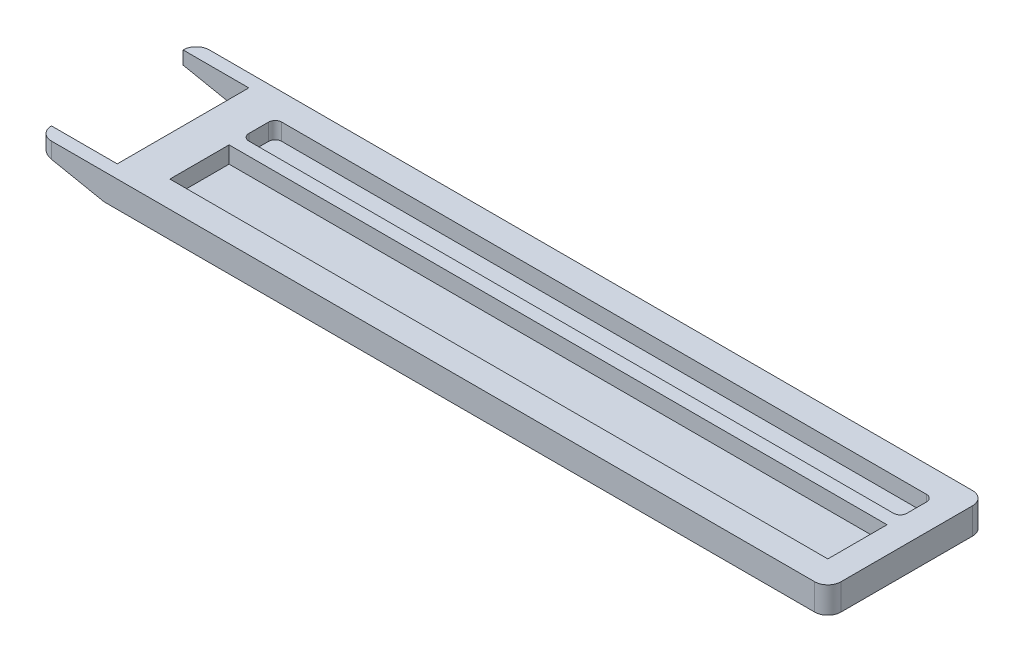
ISO-10303-21;
HEADER;
FILE_DESCRIPTION(('STEP AP214'),'2;1');
FILE_NAME('part.step','',(''),(''),'','','');
FILE_SCHEMA(('AUTOMOTIVE_DESIGN { 1 0 10303 214 1 1 1 1 }'));
ENDSEC;
DATA;
#1=APPLICATION_CONTEXT('core data for automotive mechanical design processes');
#2=APPLICATION_PROTOCOL_DEFINITION('international standard','automotive_design',2000,#1);
#3=PRODUCT_CONTEXT('',#1,'mechanical');
#4=PRODUCT('Part','Part','',(#3));
#5=PRODUCT_RELATED_PRODUCT_CATEGORY('part','',(#4));
#6=PRODUCT_DEFINITION_FORMATION('','',#4);
#7=PRODUCT_DEFINITION_CONTEXT('part definition',#1,'design');
#8=PRODUCT_DEFINITION('design','',#6,#7);
#9=PRODUCT_DEFINITION_SHAPE('','',#8);
#10=(LENGTH_UNIT() NAMED_UNIT(*) SI_UNIT(.MILLI.,.METRE.));
#11=(NAMED_UNIT(*) PLANE_ANGLE_UNIT() SI_UNIT($,.RADIAN.));
#12=(NAMED_UNIT(*) SI_UNIT($,.STERADIAN.) SOLID_ANGLE_UNIT());
#13=UNCERTAINTY_MEASURE_WITH_UNIT(LENGTH_MEASURE(1.E-05),#10,'distance_accuracy_value','');
#14=(GEOMETRIC_REPRESENTATION_CONTEXT(3) GLOBAL_UNCERTAINTY_ASSIGNED_CONTEXT((#13)) GLOBAL_UNIT_ASSIGNED_CONTEXT((#10,
#11,#12)) REPRESENTATION_CONTEXT('',''));
#15=CARTESIAN_POINT('',(0.,0.,0.));
#16=DIRECTION('',(0.,0.,1.));
#17=DIRECTION('',(1.,0.,0.));
#18=AXIS2_PLACEMENT_3D('',#15,#16,#17);
#19=CARTESIAN_POINT('',(-300.,10.,-60.001));
#20=DIRECTION('',(0.196116135138184,0.98058067569092,0.));
#21=DIRECTION('',(-0.98058067569092,0.196116135138184,0.));
#22=AXIS2_PLACEMENT_3D('',#19,#20,#21);
#23=PLANE('',#22);
#24=DIRECTION('',(0.,0.,1.));
#25=VECTOR('',#24,1.);
#26=CARTESIAN_POINT('',(-250.,0.,-60.001));
#27=LINE('',#26,#25);
#28=CARTESIAN_POINT('',(-250.,0.,-60.));
#29=VERTEX_POINT('',#28);
#30=CARTESIAN_POINT('',(-250.,0.,-50.));
#31=VERTEX_POINT('',#30);
#32=EDGE_CURVE('E347',#29,#31,#27,.T.);
#33=ORIENTED_EDGE('',*,*,#32,.T.);
#34=DIRECTION('',(0.98058067569092,-0.196116135138184,0.));
#35=VECTOR('',#34,1.);
#36=CARTESIAN_POINT('',(-298.076730769231,9.61534615384615,-49.9999999999999));
#37=LINE('',#36,#35);
#38=CARTESIAN_POINT('',(-300.,10.,-49.9999999999999));
#39=VERTEX_POINT('',#38);
#40=EDGE_CURVE('E211',#39,#31,#37,.T.);
#41=ORIENTED_EDGE('',*,*,#40,.F.);
#42=CARTESIAN_POINT('',(-290.,8.,-50.));
#43=DIRECTION('',(0.196116135138184,0.98058067569092,0.));
#44=DIRECTION('',(0.98058067569092,-0.196116135138184,0.));
#45=AXIS2_PLACEMENT_3D('',#42,#43,#44);
#46=ELLIPSE('',#45,10.1980390271856,10.);
#47=CARTESIAN_POINT('',(-290.,8.,-60.));
#48=VERTEX_POINT('',#47);
#49=EDGE_CURVE('E368',#39,#48,#46,.F.);
#50=ORIENTED_EDGE('',*,*,#49,.T.);
#51=DIRECTION('',(0.98058067569092,-0.196116135138184,0.));
#52=VECTOR('',#51,1.);
#53=CARTESIAN_POINT('',(-300.,10.,-60.));
#54=LINE('',#53,#52);
#55=EDGE_CURVE('E297',#48,#29,#54,.T.);
#56=ORIENTED_EDGE('',*,*,#55,.T.);
#57=EDGE_LOOP('',(#33,#41,#50,#56));
#58=FACE_BOUND('',#57,.T.);
#59=ADVANCED_FACE('F36',(#58),#23,.F.);
#60=CARTESIAN_POINT('',(300.,20.,60.));
#61=DIRECTION('',(0.,0.,-1.));
#62=DIRECTION('',(-1.,0.,0.));
#63=AXIS2_PLACEMENT_3D('',#60,#61,#62);
#64=PLANE('',#63);
#65=DIRECTION('',(1.,0.,0.));
#66=VECTOR('',#65,1.);
#67=CARTESIAN_POINT('',(300.,20.,60.));
#68=LINE('',#67,#66);
#69=CARTESIAN_POINT('',(-290.,20.,60.));
#70=VERTEX_POINT('',#69);
#71=CARTESIAN_POINT('',(290.,20.,60.));
#72=VERTEX_POINT('',#71);
#73=EDGE_CURVE('E351',#70,#72,#68,.T.);
#74=ORIENTED_EDGE('',*,*,#73,.F.);
#75=DIRECTION('',(0.,-1.,0.));
#76=VECTOR('',#75,1.);
#77=CARTESIAN_POINT('',(-290.,20.,60.));
#78=LINE('',#77,#76);
#79=CARTESIAN_POINT('',(-290.,8.,60.));
#80=VERTEX_POINT('',#79);
#81=EDGE_CURVE('E216',#70,#80,#78,.T.);
#82=ORIENTED_EDGE('',*,*,#81,.T.);
#83=DIRECTION('',(-0.98058067569092,0.196116135138184,0.));
#84=VECTOR('',#83,1.);
#85=CARTESIAN_POINT('',(-300.,10.,60.));
#86=LINE('',#85,#84);
#87=CARTESIAN_POINT('',(-250.,0.,60.));
#88=VERTEX_POINT('',#87);
#89=EDGE_CURVE('E300',#88,#80,#86,.T.);
#90=ORIENTED_EDGE('',*,*,#89,.F.);
#91=DIRECTION('',(1.,0.,0.));
#92=VECTOR('',#91,1.);
#93=CARTESIAN_POINT('',(300.,0.,60.));
#94=LINE('',#93,#92);
#95=CARTESIAN_POINT('',(290.,0.,60.));
#96=VERTEX_POINT('',#95);
#97=EDGE_CURVE('E350',#88,#96,#94,.T.);
#98=ORIENTED_EDGE('',*,*,#97,.T.);
#99=DIRECTION('',(0.,-1.,0.));
#100=VECTOR('',#99,1.);
#101=CARTESIAN_POINT('',(290.,20.,60.));
#102=LINE('',#101,#100);
#103=EDGE_CURVE('E221',#96,#72,#102,.F.);
#104=ORIENTED_EDGE('',*,*,#103,.T.);
#105=EDGE_LOOP('',(#74,#82,#90,#98,#104));
#106=FACE_BOUND('',#105,.T.);
#107=ADVANCED_FACE('F392',(#106),#64,.F.);
#108=CARTESIAN_POINT('',(300.,20.,60.));
#109=DIRECTION('',(-1.,0.,0.));
#110=DIRECTION('',(0.,0.,1.));
#111=AXIS2_PLACEMENT_3D('',#108,#109,#110);
#112=PLANE('',#111);
#113=DIRECTION('',(0.,0.,-1.));
#114=VECTOR('',#113,1.);
#115=CARTESIAN_POINT('',(300.,0.,60.));
#116=LINE('',#115,#114);
#117=CARTESIAN_POINT('',(300.,0.,50.));
#118=VERTEX_POINT('',#117);
#119=CARTESIAN_POINT('',(300.,0.,-50.));
#120=VERTEX_POINT('',#119);
#121=EDGE_CURVE('E361',#118,#120,#116,.T.);
#122=ORIENTED_EDGE('',*,*,#121,.T.);
#123=DIRECTION('',(0.,-1.,0.));
#124=VECTOR('',#123,1.);
#125=CARTESIAN_POINT('',(300.,20.,-50.));
#126=LINE('',#125,#124);
#127=CARTESIAN_POINT('',(300.,20.,-50.));
#128=VERTEX_POINT('',#127);
#129=EDGE_CURVE('E236',#120,#128,#126,.F.);
#130=ORIENTED_EDGE('',*,*,#129,.T.);
#131=DIRECTION('',(0.,0.,-1.));
#132=VECTOR('',#131,1.);
#133=CARTESIAN_POINT('',(300.,20.,60.));
#134=LINE('',#133,#132);
#135=CARTESIAN_POINT('',(300.,20.,50.));
#136=VERTEX_POINT('',#135);
#137=EDGE_CURVE('E353',#136,#128,#134,.T.);
#138=ORIENTED_EDGE('',*,*,#137,.F.);
#139=DIRECTION('',(0.,-1.,0.));
#140=VECTOR('',#139,1.);
#141=CARTESIAN_POINT('',(300.,20.,50.));
#142=LINE('',#141,#140);
#143=EDGE_CURVE('E233',#136,#118,#142,.T.);
#144=ORIENTED_EDGE('',*,*,#143,.T.);
#145=EDGE_LOOP('',(#122,#130,#138,#144));
#146=FACE_BOUND('',#145,.T.);
#147=ADVANCED_FACE('F381',(#146),#112,.F.);
#148=CARTESIAN_POINT('',(300.,20.,-60.));
#149=DIRECTION('',(0.,0.,1.));
#150=DIRECTION('',(1.,0.,0.));
#151=AXIS2_PLACEMENT_3D('',#148,#149,#150);
#152=PLANE('',#151);
#153=ORIENTED_EDGE('',*,*,#55,.F.);
#154=DIRECTION('',(0.,-1.,0.));
#155=VECTOR('',#154,1.);
#156=CARTESIAN_POINT('',(-290.,20.,-60.));
#157=LINE('',#156,#155);
#158=CARTESIAN_POINT('',(-290.,20.,-60.));
#159=VERTEX_POINT('',#158);
#160=EDGE_CURVE('E373',#48,#159,#157,.F.);
#161=ORIENTED_EDGE('',*,*,#160,.T.);
#162=DIRECTION('',(-1.,0.,0.));
#163=VECTOR('',#162,1.);
#164=CARTESIAN_POINT('',(300.,20.,-60.));
#165=LINE('',#164,#163);
#166=CARTESIAN_POINT('',(290.,20.,-60.));
#167=VERTEX_POINT('',#166);
#168=EDGE_CURVE('E201',#167,#159,#165,.T.);
#169=ORIENTED_EDGE('',*,*,#168,.F.);
#170=DIRECTION('',(0.,-1.,0.));
#171=VECTOR('',#170,1.);
#172=CARTESIAN_POINT('',(290.,20.,-60.));
#173=LINE('',#172,#171);
#174=CARTESIAN_POINT('',(290.,0.,-60.));
#175=VERTEX_POINT('',#174);
#176=EDGE_CURVE('E370',#167,#175,#173,.T.);
#177=ORIENTED_EDGE('',*,*,#176,.T.);
#178=DIRECTION('',(-1.,0.,0.));
#179=VECTOR('',#178,1.);
#180=CARTESIAN_POINT('',(300.,0.,-60.));
#181=LINE('',#180,#179);
#182=EDGE_CURVE('E354',#175,#29,#181,.T.);
#183=ORIENTED_EDGE('',*,*,#182,.T.);
#184=EDGE_LOOP('',(#153,#161,#169,#177,#183));
#185=FACE_BOUND('',#184,.T.);
#186=ADVANCED_FACE('F408',(#185),#152,.F.);
#187=CARTESIAN_POINT('',(0.,20.,0.));
#188=DIRECTION('',(0.,1.,0.));
#189=DIRECTION('',(0.,0.,1.));
#190=AXIS2_PLACEMENT_3D('',#187,#188,#189);
#191=PLANE('',#190);
#192=DIRECTION('',(-1.,0.,0.));
#193=VECTOR('',#192,1.);
#194=CARTESIAN_POINT('',(-300.,20.,-49.9999999999999));
#195=LINE('',#194,#193);
#196=CARTESIAN_POINT('',(-250.,20.,-50.));
#197=VERTEX_POINT('',#196);
#198=CARTESIAN_POINT('',(-300.,20.,-49.9999999999999));
#199=VERTEX_POINT('',#198);
#200=EDGE_CURVE('E414',#197,#199,#195,.T.);
#201=ORIENTED_EDGE('',*,*,#200,.F.);
#202=DIRECTION('',(0.,0.,-1.));
#203=VECTOR('',#202,1.);
#204=CARTESIAN_POINT('',(-250.,20.,-50.));
#205=LINE('',#204,#203);
#206=CARTESIAN_POINT('',(-250.,20.,50.0000000000001));
#207=VERTEX_POINT('',#206);
#208=EDGE_CURVE('E210',#207,#197,#205,.T.);
#209=ORIENTED_EDGE('',*,*,#208,.F.);
#210=DIRECTION('',(1.,0.,0.));
#211=VECTOR('',#210,1.);
#212=CARTESIAN_POINT('',(-300.,20.,50.));
#213=LINE('',#212,#211);
#214=CARTESIAN_POINT('',(-300.,20.,50.));
#215=VERTEX_POINT('',#214);
#216=EDGE_CURVE('E193',#215,#207,#213,.T.);
#217=ORIENTED_EDGE('',*,*,#216,.F.);
#218=CARTESIAN_POINT('',(-290.,20.,50.));
#219=DIRECTION('',(0.,1.,0.));
#220=DIRECTION('',(0.,0.,1.));
#221=AXIS2_PLACEMENT_3D('',#218,#219,#220);
#222=CIRCLE('',#221,10.);
#223=EDGE_CURVE('E207',#215,#70,#222,.T.);
#224=ORIENTED_EDGE('',*,*,#223,.T.);
#225=ORIENTED_EDGE('',*,*,#73,.T.);
#226=CARTESIAN_POINT('',(290.,20.,50.));
#227=DIRECTION('',(0.,1.,0.));
#228=DIRECTION('',(0.,0.,1.));
#229=AXIS2_PLACEMENT_3D('',#226,#227,#228);
#230=CIRCLE('',#229,10.);
#231=EDGE_CURVE('E223',#72,#136,#230,.T.);
#232=ORIENTED_EDGE('',*,*,#231,.T.);
#233=ORIENTED_EDGE('',*,*,#137,.T.);
#234=CARTESIAN_POINT('',(290.,20.,-50.));
#235=DIRECTION('',(0.,1.,0.));
#236=DIRECTION('',(0.,0.,1.));
#237=AXIS2_PLACEMENT_3D('',#234,#235,#236);
#238=CIRCLE('',#237,10.);
#239=EDGE_CURVE('E218',#128,#167,#238,.T.);
#240=ORIENTED_EDGE('',*,*,#239,.T.);
#241=ORIENTED_EDGE('',*,*,#168,.T.);
#242=CARTESIAN_POINT('',(-290.,20.,-50.));
#243=DIRECTION('',(0.,1.,0.));
#244=DIRECTION('',(0.,0.,1.));
#245=AXIS2_PLACEMENT_3D('',#242,#243,#244);
#246=CIRCLE('',#245,10.);
#247=EDGE_CURVE('E217',#159,#199,#246,.T.);
#248=ORIENTED_EDGE('',*,*,#247,.T.);
#249=EDGE_LOOP('',(#201,#209,#217,#224,#225,#232,#233,#240,#241,#248));
#250=FACE_BOUND('',#249,.T.);
#251=DIRECTION('',(0.,0.,1.));
#252=VECTOR('',#251,1.);
#253=CARTESIAN_POINT('',(-220.,20.,-40.));
#254=LINE('',#253,#252);
#255=CARTESIAN_POINT('',(-220.,20.,-35.));
#256=VERTEX_POINT('',#255);
#257=CARTESIAN_POINT('',(-220.,20.,-20.));
#258=VERTEX_POINT('',#257);
#259=EDGE_CURVE('E306',#256,#258,#254,.T.);
#260=ORIENTED_EDGE('',*,*,#259,.F.);
#261=CARTESIAN_POINT('',(-215.,20.,-35.));
#262=DIRECTION('',(0.,1.,0.));
#263=DIRECTION('',(0.,0.,1.));
#264=AXIS2_PLACEMENT_3D('',#261,#262,#263);
#265=CIRCLE('',#264,5.);
#266=CARTESIAN_POINT('',(-215.,20.,-40.));
#267=VERTEX_POINT('',#266);
#268=EDGE_CURVE('E11',#256,#267,#265,.F.);
#269=ORIENTED_EDGE('',*,*,#268,.T.);
#270=DIRECTION('',(-1.,0.,0.));
#271=VECTOR('',#270,1.);
#272=CARTESIAN_POINT('',(-220.,20.,-40.));
#273=LINE('',#272,#271);
#274=CARTESIAN_POINT('',(275.,20.,-40.));
#275=VERTEX_POINT('',#274);
#276=EDGE_CURVE('E274',#275,#267,#273,.T.);
#277=ORIENTED_EDGE('',*,*,#276,.F.);
#278=CARTESIAN_POINT('',(275.,20.,-35.));
#279=DIRECTION('',(0.,1.,0.));
#280=DIRECTION('',(0.,0.,1.));
#281=AXIS2_PLACEMENT_3D('',#278,#279,#280);
#282=CIRCLE('',#281,5.);
#283=CARTESIAN_POINT('',(280.,20.,-35.));
#284=VERTEX_POINT('',#283);
#285=EDGE_CURVE('E267',#275,#284,#282,.F.);
#286=ORIENTED_EDGE('',*,*,#285,.T.);
#287=DIRECTION('',(0.,0.,-1.));
#288=VECTOR('',#287,1.);
#289=CARTESIAN_POINT('',(280.,20.,-40.));
#290=LINE('',#289,#288);
#291=CARTESIAN_POINT('',(280.,20.,-20.));
#292=VERTEX_POINT('',#291);
#293=EDGE_CURVE('E272',#292,#284,#290,.T.);
#294=ORIENTED_EDGE('',*,*,#293,.F.);
#295=CARTESIAN_POINT('',(275.,20.,-20.));
#296=DIRECTION('',(0.,1.,0.));
#297=DIRECTION('',(0.,0.,1.));
#298=AXIS2_PLACEMENT_3D('',#295,#296,#297);
#299=CIRCLE('',#298,5.);
#300=CARTESIAN_POINT('',(275.,20.,-15.));
#301=VERTEX_POINT('',#300);
#302=EDGE_CURVE('E265',#292,#301,#299,.F.);
#303=ORIENTED_EDGE('',*,*,#302,.T.);
#304=DIRECTION('',(1.,0.,0.));
#305=VECTOR('',#304,1.);
#306=CARTESIAN_POINT('',(-220.,20.,-15.));
#307=LINE('',#306,#305);
#308=CARTESIAN_POINT('',(-215.,20.,-15.));
#309=VERTEX_POINT('',#308);
#310=EDGE_CURVE('E283',#309,#301,#307,.T.);
#311=ORIENTED_EDGE('',*,*,#310,.F.);
#312=CARTESIAN_POINT('',(-215.,20.,-20.));
#313=DIRECTION('',(0.,1.,0.));
#314=DIRECTION('',(0.,0.,1.));
#315=AXIS2_PLACEMENT_3D('',#312,#313,#314);
#316=CIRCLE('',#315,5.);
#317=EDGE_CURVE('E44',#309,#258,#316,.F.);
#318=ORIENTED_EDGE('',*,*,#317,.T.);
#319=EDGE_LOOP('',(#260,#269,#277,#286,#294,#303,#311,#318));
#320=FACE_BOUND('',#319,.T.);
#321=DIRECTION('',(0.,0.,1.));
#322=VECTOR('',#321,1.);
#323=CARTESIAN_POINT('',(-220.,20.,-4.99999999999995));
#324=LINE('',#323,#322);
#325=CARTESIAN_POINT('',(-220.,20.,-4.99999999999995));
#326=VERTEX_POINT('',#325);
#327=CARTESIAN_POINT('',(-220.,20.,40.));
#328=VERTEX_POINT('',#327);
#329=EDGE_CURVE('E327',#326,#328,#324,.T.);
#330=ORIENTED_EDGE('',*,*,#329,.F.);
#331=DIRECTION('',(-1.,0.,0.));
#332=VECTOR('',#331,1.);
#333=CARTESIAN_POINT('',(-220.,20.,-4.99999999999995));
#334=LINE('',#333,#332);
#335=CARTESIAN_POINT('',(280.,20.,-4.99999999999995));
#336=VERTEX_POINT('',#335);
#337=EDGE_CURVE('E317',#336,#326,#334,.T.);
#338=ORIENTED_EDGE('',*,*,#337,.F.);
#339=DIRECTION('',(0.,0.,-1.));
#340=VECTOR('',#339,1.);
#341=CARTESIAN_POINT('',(280.,20.,-4.99999999999995));
#342=LINE('',#341,#340);
#343=CARTESIAN_POINT('',(280.,20.,40.));
#344=VERTEX_POINT('',#343);
#345=EDGE_CURVE('E332',#344,#336,#342,.T.);
#346=ORIENTED_EDGE('',*,*,#345,.F.);
#347=DIRECTION('',(1.,0.,0.));
#348=VECTOR('',#347,1.);
#349=CARTESIAN_POINT('',(-220.,20.,40.));
#350=LINE('',#349,#348);
#351=EDGE_CURVE('E329',#328,#344,#350,.T.);
#352=ORIENTED_EDGE('',*,*,#351,.F.);
#353=EDGE_LOOP('',(#330,#338,#346,#352));
#354=FACE_BOUND('',#353,.T.);
#355=ADVANCED_FACE('F205',(#250,#320,#354),#191,.T.);
#356=CARTESIAN_POINT('',(0.,0.,0.));
#357=DIRECTION('',(0.,1.,0.));
#358=DIRECTION('',(0.,0.,1.));
#359=AXIS2_PLACEMENT_3D('',#356,#357,#358);
#360=PLANE('',#359);
#361=ORIENTED_EDGE('',*,*,#182,.F.);
#362=CARTESIAN_POINT('',(290.,0.,-50.));
#363=DIRECTION('',(0.,1.,0.));
#364=DIRECTION('',(0.,0.,1.));
#365=AXIS2_PLACEMENT_3D('',#362,#363,#364);
#366=CIRCLE('',#365,10.);
#367=EDGE_CURVE('E231',#175,#120,#366,.F.);
#368=ORIENTED_EDGE('',*,*,#367,.T.);
#369=ORIENTED_EDGE('',*,*,#121,.F.);
#370=CARTESIAN_POINT('',(290.,0.,50.));
#371=DIRECTION('',(0.,1.,0.));
#372=DIRECTION('',(0.,0.,1.));
#373=AXIS2_PLACEMENT_3D('',#370,#371,#372);
#374=CIRCLE('',#373,10.);
#375=EDGE_CURVE('E229',#118,#96,#374,.F.);
#376=ORIENTED_EDGE('',*,*,#375,.T.);
#377=ORIENTED_EDGE('',*,*,#97,.F.);
#378=CARTESIAN_POINT('',(-250.,0.,50.0000000000001));
#379=VERTEX_POINT('',#378);
#380=EDGE_CURVE('E346',#379,#88,#27,.T.);
#381=ORIENTED_EDGE('',*,*,#380,.F.);
#382=DIRECTION('',(0.,0.,1.));
#383=VECTOR('',#382,1.);
#384=CARTESIAN_POINT('',(-250.,0.,-60.001));
#385=LINE('',#384,#383);
#386=EDGE_CURVE('E398',#31,#379,#385,.T.);
#387=ORIENTED_EDGE('',*,*,#386,.F.);
#388=ORIENTED_EDGE('',*,*,#32,.F.);
#389=EDGE_LOOP('',(#361,#368,#369,#376,#377,#381,#387,#388));
#390=FACE_BOUND('',#389,.T.);
#391=ADVANCED_FACE('F388',(#390),#360,.F.);
#392=CARTESIAN_POINT('',(-290.,8.,50.));
#393=DIRECTION('',(0.196116135138184,0.98058067569092,0.));
#394=DIRECTION('',(0.98058067569092,-0.196116135138184,0.));
#395=AXIS2_PLACEMENT_3D('',#392,#393,#394);
#396=ELLIPSE('',#395,10.1980390271856,10.);
#397=CARTESIAN_POINT('',(-300.,10.,50.));
#398=VERTEX_POINT('',#397);
#399=EDGE_CURVE('E366',#80,#398,#396,.F.);
#400=ORIENTED_EDGE('',*,*,#399,.T.);
#401=DIRECTION('',(-0.98058067569092,0.196116135138184,0.));
#402=VECTOR('',#401,1.);
#403=CARTESIAN_POINT('',(-298.076730769231,9.61534615384615,50.));
#404=LINE('',#403,#402);
#405=EDGE_CURVE('E196',#379,#398,#404,.T.);
#406=ORIENTED_EDGE('',*,*,#405,.F.);
#407=ORIENTED_EDGE('',*,*,#380,.T.);
#408=ORIENTED_EDGE('',*,*,#89,.T.);
#409=EDGE_LOOP('',(#400,#406,#407,#408));
#410=FACE_BOUND('',#409,.T.);
#411=ADVANCED_FACE('F394',(#410),#23,.F.);
#412=CARTESIAN_POINT('',(-220.,7.3,-4.99999999999995));
#413=DIRECTION('',(-1.,0.,0.));
#414=DIRECTION('',(0.,0.,1.));
#415=AXIS2_PLACEMENT_3D('',#412,#413,#414);
#416=PLANE('',#415);
#417=ORIENTED_EDGE('',*,*,#329,.T.);
#418=DIRECTION('',(0.,1.,0.));
#419=VECTOR('',#418,1.);
#420=CARTESIAN_POINT('',(-220.,7.3,40.));
#421=LINE('',#420,#419);
#422=CARTESIAN_POINT('',(-220.,7.3,40.));
#423=VERTEX_POINT('',#422);
#424=EDGE_CURVE('E326',#423,#328,#421,.T.);
#425=ORIENTED_EDGE('',*,*,#424,.F.);
#426=DIRECTION('',(0.,0.,1.));
#427=VECTOR('',#426,1.);
#428=CARTESIAN_POINT('',(-220.,7.3,-4.99999999999995));
#429=LINE('',#428,#427);
#430=CARTESIAN_POINT('',(-220.,7.3,-4.99999999999995));
#431=VERTEX_POINT('',#430);
#432=EDGE_CURVE('E313',#431,#423,#429,.T.);
#433=ORIENTED_EDGE('',*,*,#432,.F.);
#434=DIRECTION('',(0.,1.,0.));
#435=VECTOR('',#434,1.);
#436=CARTESIAN_POINT('',(-220.,7.3,-4.99999999999995));
#437=LINE('',#436,#435);
#438=EDGE_CURVE('E308',#431,#326,#437,.T.);
#439=ORIENTED_EDGE('',*,*,#438,.T.);
#440=EDGE_LOOP('',(#417,#425,#433,#439));
#441=FACE_BOUND('',#440,.T.);
#442=ADVANCED_FACE('F436',(#441),#416,.F.);
#443=CARTESIAN_POINT('',(-220.,7.3,-4.99999999999995));
#444=DIRECTION('',(0.,0.,-1.));
#445=DIRECTION('',(-1.,0.,0.));
#446=AXIS2_PLACEMENT_3D('',#443,#444,#445);
#447=PLANE('',#446);
#448=ORIENTED_EDGE('',*,*,#337,.T.);
#449=ORIENTED_EDGE('',*,*,#438,.F.);
#450=DIRECTION('',(-1.,0.,0.));
#451=VECTOR('',#450,1.);
#452=CARTESIAN_POINT('',(-220.,7.3,-4.99999999999995));
#453=LINE('',#452,#451);
#454=CARTESIAN_POINT('',(280.,7.3,-4.99999999999995));
#455=VERTEX_POINT('',#454);
#456=EDGE_CURVE('E323',#455,#431,#453,.T.);
#457=ORIENTED_EDGE('',*,*,#456,.F.);
#458=DIRECTION('',(0.,1.,0.));
#459=VECTOR('',#458,1.);
#460=CARTESIAN_POINT('',(280.,7.3,-4.99999999999995));
#461=LINE('',#460,#459);
#462=EDGE_CURVE('E338',#455,#336,#461,.T.);
#463=ORIENTED_EDGE('',*,*,#462,.T.);
#464=EDGE_LOOP('',(#448,#449,#457,#463));
#465=FACE_BOUND('',#464,.T.);
#466=ADVANCED_FACE('F441',(#465),#447,.F.);
#467=CARTESIAN_POINT('',(280.,7.3,-4.99999999999995));
#468=DIRECTION('',(1.,0.,0.));
#469=DIRECTION('',(0.,0.,-1.));
#470=AXIS2_PLACEMENT_3D('',#467,#468,#469);
#471=PLANE('',#470);
#472=ORIENTED_EDGE('',*,*,#345,.T.);
#473=ORIENTED_EDGE('',*,*,#462,.F.);
#474=DIRECTION('',(0.,0.,-1.));
#475=VECTOR('',#474,1.);
#476=CARTESIAN_POINT('',(280.,7.3,-4.99999999999995));
#477=LINE('',#476,#475);
#478=CARTESIAN_POINT('',(280.,7.3,40.));
#479=VERTEX_POINT('',#478);
#480=EDGE_CURVE('E320',#479,#455,#477,.T.);
#481=ORIENTED_EDGE('',*,*,#480,.F.);
#482=DIRECTION('',(0.,1.,0.));
#483=VECTOR('',#482,1.);
#484=CARTESIAN_POINT('',(280.,7.3,40.));
#485=LINE('',#484,#483);
#486=EDGE_CURVE('E340',#479,#344,#485,.T.);
#487=ORIENTED_EDGE('',*,*,#486,.T.);
#488=EDGE_LOOP('',(#472,#473,#481,#487));
#489=FACE_BOUND('',#488,.T.);
#490=ADVANCED_FACE('F481',(#489),#471,.F.);
#491=CARTESIAN_POINT('',(-220.,7.3,40.));
#492=DIRECTION('',(0.,0.,1.));
#493=DIRECTION('',(1.,0.,0.));
#494=AXIS2_PLACEMENT_3D('',#491,#492,#493);
#495=PLANE('',#494);
#496=ORIENTED_EDGE('',*,*,#351,.T.);
#497=ORIENTED_EDGE('',*,*,#486,.F.);
#498=DIRECTION('',(1.,0.,0.));
#499=VECTOR('',#498,1.);
#500=CARTESIAN_POINT('',(-220.,7.3,40.));
#501=LINE('',#500,#499);
#502=EDGE_CURVE('E316',#423,#479,#501,.T.);
#503=ORIENTED_EDGE('',*,*,#502,.F.);
#504=ORIENTED_EDGE('',*,*,#424,.T.);
#505=EDGE_LOOP('',(#496,#497,#503,#504));
#506=FACE_BOUND('',#505,.T.);
#507=ADVANCED_FACE('F477',(#506),#495,.F.);
#508=CARTESIAN_POINT('',(0.,7.3,0.));
#509=DIRECTION('',(0.,1.,0.));
#510=DIRECTION('',(0.,0.,1.));
#511=AXIS2_PLACEMENT_3D('',#508,#509,#510);
#512=PLANE('',#511);
#513=ORIENTED_EDGE('',*,*,#432,.T.);
#514=ORIENTED_EDGE('',*,*,#502,.T.);
#515=ORIENTED_EDGE('',*,*,#480,.T.);
#516=ORIENTED_EDGE('',*,*,#456,.T.);
#517=EDGE_LOOP('',(#513,#514,#515,#516));
#518=FACE_BOUND('',#517,.T.);
#519=ADVANCED_FACE('F473',(#518),#512,.T.);
#520=CARTESIAN_POINT('',(-220.,7.3,-40.));
#521=DIRECTION('',(-1.,0.,0.));
#522=DIRECTION('',(0.,0.,1.));
#523=AXIS2_PLACEMENT_3D('',#520,#521,#522);
#524=PLANE('',#523);
#525=ORIENTED_EDGE('',*,*,#259,.T.);
#526=DIRECTION('',(0.,1.,0.));
#527=VECTOR('',#526,1.);
#528=CARTESIAN_POINT('',(-220.,7.3,-20.));
#529=LINE('',#528,#527);
#530=CARTESIAN_POINT('',(-220.,7.3,-20.));
#531=VERTEX_POINT('',#530);
#532=EDGE_CURVE('E263',#258,#531,#529,.F.);
#533=ORIENTED_EDGE('',*,*,#532,.T.);
#534=DIRECTION('',(0.,0.,1.));
#535=VECTOR('',#534,1.);
#536=CARTESIAN_POINT('',(-220.,7.3,-40.));
#537=LINE('',#536,#535);
#538=CARTESIAN_POINT('',(-220.,7.3,-35.));
#539=VERTEX_POINT('',#538);
#540=EDGE_CURVE('E312',#539,#531,#537,.T.);
#541=ORIENTED_EDGE('',*,*,#540,.F.);
#542=DIRECTION('',(0.,1.,0.));
#543=VECTOR('',#542,1.);
#544=CARTESIAN_POINT('',(-220.,20.,-35.));
#545=LINE('',#544,#543);
#546=EDGE_CURVE('E261',#539,#256,#545,.T.);
#547=ORIENTED_EDGE('',*,*,#546,.T.);
#548=EDGE_LOOP('',(#525,#533,#541,#547));
#549=FACE_BOUND('',#548,.T.);
#550=ADVANCED_FACE('F468',(#549),#524,.F.);
#551=CARTESIAN_POINT('',(-220.,7.3,-40.));
#552=DIRECTION('',(0.,0.,-1.));
#553=DIRECTION('',(-1.,0.,0.));
#554=AXIS2_PLACEMENT_3D('',#551,#552,#553);
#555=PLANE('',#554);
#556=DIRECTION('',(-1.,0.,0.));
#557=VECTOR('',#556,1.);
#558=CARTESIAN_POINT('',(-220.,7.3,-40.));
#559=LINE('',#558,#557);
#560=CARTESIAN_POINT('',(275.,7.3,-40.));
#561=VERTEX_POINT('',#560);
#562=CARTESIAN_POINT('',(-215.,7.3,-40.));
#563=VERTEX_POINT('',#562);
#564=EDGE_CURVE('E292',#561,#563,#559,.T.);
#565=ORIENTED_EDGE('',*,*,#564,.F.);
#566=DIRECTION('',(0.,1.,0.));
#567=VECTOR('',#566,1.);
#568=CARTESIAN_POINT('',(275.,20.,-40.));
#569=LINE('',#568,#567);
#570=EDGE_CURVE('E258',#561,#275,#569,.T.);
#571=ORIENTED_EDGE('',*,*,#570,.T.);
#572=ORIENTED_EDGE('',*,*,#276,.T.);
#573=DIRECTION('',(0.,1.,0.));
#574=VECTOR('',#573,1.);
#575=CARTESIAN_POINT('',(-215.,7.3,-40.));
#576=LINE('',#575,#574);
#577=EDGE_CURVE('E256',#267,#563,#576,.F.);
#578=ORIENTED_EDGE('',*,*,#577,.T.);
#579=EDGE_LOOP('',(#565,#571,#572,#578));
#580=FACE_BOUND('',#579,.T.);
#581=ADVANCED_FACE('F296',(#580),#555,.F.);
#582=CARTESIAN_POINT('',(280.,7.3,-40.));
#583=DIRECTION('',(1.,0.,0.));
#584=DIRECTION('',(0.,0.,-1.));
#585=AXIS2_PLACEMENT_3D('',#582,#583,#584);
#586=PLANE('',#585);
#587=DIRECTION('',(0.,0.,-1.));
#588=VECTOR('',#587,1.);
#589=CARTESIAN_POINT('',(280.,7.3,-40.));
#590=LINE('',#589,#588);
#591=CARTESIAN_POINT('',(280.,7.3,-20.));
#592=VERTEX_POINT('',#591);
#593=CARTESIAN_POINT('',(280.,7.3,-35.));
#594=VERTEX_POINT('',#593);
#595=EDGE_CURVE('E294',#592,#594,#590,.T.);
#596=ORIENTED_EDGE('',*,*,#595,.F.);
#597=DIRECTION('',(0.,1.,0.));
#598=VECTOR('',#597,1.);
#599=CARTESIAN_POINT('',(280.,20.,-20.));
#600=LINE('',#599,#598);
#601=EDGE_CURVE('E240',#592,#292,#600,.T.);
#602=ORIENTED_EDGE('',*,*,#601,.T.);
#603=ORIENTED_EDGE('',*,*,#293,.T.);
#604=DIRECTION('',(0.,1.,0.));
#605=VECTOR('',#604,1.);
#606=CARTESIAN_POINT('',(280.,7.3,-35.));
#607=LINE('',#606,#605);
#608=EDGE_CURVE('E238',#284,#594,#607,.F.);
#609=ORIENTED_EDGE('',*,*,#608,.T.);
#610=EDGE_LOOP('',(#596,#602,#603,#609));
#611=FACE_BOUND('',#610,.T.);
#612=ADVANCED_FACE('F280',(#611),#586,.F.);
#613=CARTESIAN_POINT('',(-220.,7.3,-15.));
#614=DIRECTION('',(0.,0.,1.));
#615=DIRECTION('',(1.,0.,0.));
#616=AXIS2_PLACEMENT_3D('',#613,#614,#615);
#617=PLANE('',#616);
#618=ORIENTED_EDGE('',*,*,#310,.T.);
#619=DIRECTION('',(0.,1.,0.));
#620=VECTOR('',#619,1.);
#621=CARTESIAN_POINT('',(275.,7.3,-15.));
#622=LINE('',#621,#620);
#623=CARTESIAN_POINT('',(275.,7.3,-15.));
#624=VERTEX_POINT('',#623);
#625=EDGE_CURVE('E246',#301,#624,#622,.F.);
#626=ORIENTED_EDGE('',*,*,#625,.T.);
#627=DIRECTION('',(1.,0.,0.));
#628=VECTOR('',#627,1.);
#629=CARTESIAN_POINT('',(-220.,7.3,-15.));
#630=LINE('',#629,#628);
#631=CARTESIAN_POINT('',(-215.,7.3,-15.));
#632=VERTEX_POINT('',#631);
#633=EDGE_CURVE('E302',#632,#624,#630,.T.);
#634=ORIENTED_EDGE('',*,*,#633,.F.);
#635=DIRECTION('',(0.,1.,0.));
#636=VECTOR('',#635,1.);
#637=CARTESIAN_POINT('',(-215.,20.,-15.));
#638=LINE('',#637,#636);
#639=EDGE_CURVE('E243',#632,#309,#638,.T.);
#640=ORIENTED_EDGE('',*,*,#639,.T.);
#641=EDGE_LOOP('',(#618,#626,#634,#640));
#642=FACE_BOUND('',#641,.T.);
#643=ADVANCED_FACE('F456',(#642),#617,.F.);
#644=CARTESIAN_POINT('',(0.,7.3,0.));
#645=DIRECTION('',(0.,1.,0.));
#646=DIRECTION('',(0.,0.,1.));
#647=AXIS2_PLACEMENT_3D('',#644,#645,#646);
#648=PLANE('',#647);
#649=ORIENTED_EDGE('',*,*,#633,.T.);
#650=CARTESIAN_POINT('',(275.,7.3,-20.));
#651=DIRECTION('',(0.,1.,0.));
#652=DIRECTION('',(0.,0.,1.));
#653=AXIS2_PLACEMENT_3D('',#650,#651,#652);
#654=CIRCLE('',#653,5.);
#655=EDGE_CURVE('E254',#624,#592,#654,.T.);
#656=ORIENTED_EDGE('',*,*,#655,.T.);
#657=ORIENTED_EDGE('',*,*,#595,.T.);
#658=CARTESIAN_POINT('',(275.,7.3,-35.));
#659=DIRECTION('',(0.,1.,0.));
#660=DIRECTION('',(0.,0.,1.));
#661=AXIS2_PLACEMENT_3D('',#658,#659,#660);
#662=CIRCLE('',#661,5.);
#663=EDGE_CURVE('E252',#594,#561,#662,.T.);
#664=ORIENTED_EDGE('',*,*,#663,.T.);
#665=ORIENTED_EDGE('',*,*,#564,.T.);
#666=CARTESIAN_POINT('',(-215.,7.3,-35.));
#667=DIRECTION('',(0.,1.,0.));
#668=DIRECTION('',(0.,0.,1.));
#669=AXIS2_PLACEMENT_3D('',#666,#667,#668);
#670=CIRCLE('',#669,5.);
#671=EDGE_CURVE('E248',#563,#539,#670,.T.);
#672=ORIENTED_EDGE('',*,*,#671,.T.);
#673=ORIENTED_EDGE('',*,*,#540,.T.);
#674=CARTESIAN_POINT('',(-215.,7.3,-20.));
#675=DIRECTION('',(0.,1.,0.));
#676=DIRECTION('',(0.,0.,1.));
#677=AXIS2_PLACEMENT_3D('',#674,#675,#676);
#678=CIRCLE('',#677,5.);
#679=EDGE_CURVE('E250',#531,#632,#678,.T.);
#680=ORIENTED_EDGE('',*,*,#679,.T.);
#681=EDGE_LOOP('',(#649,#656,#657,#664,#665,#672,#673,#680));
#682=FACE_BOUND('',#681,.T.);
#683=ADVANCED_FACE('F291',(#682),#648,.T.);
#684=CARTESIAN_POINT('',(-290.,20.,-50.));
#685=DIRECTION('',(0.,-1.,0.));
#686=DIRECTION('',(0.,0.,-1.));
#687=AXIS2_PLACEMENT_3D('',#684,#685,#686);
#688=CYLINDRICAL_SURFACE('',#687,10.);
#689=ORIENTED_EDGE('',*,*,#247,.F.);
#690=ORIENTED_EDGE('',*,*,#160,.F.);
#691=ORIENTED_EDGE('',*,*,#49,.F.);
#692=DIRECTION('',(0.,-1.,0.));
#693=VECTOR('',#692,1.);
#694=CARTESIAN_POINT('',(-300.,20.,-50.));
#695=LINE('',#694,#693);
#696=EDGE_CURVE('E200',#199,#39,#695,.T.);
#697=ORIENTED_EDGE('',*,*,#696,.F.);
#698=EDGE_LOOP('',(#689,#690,#691,#697));
#699=FACE_BOUND('',#698,.T.);
#700=ADVANCED_FACE('F412',(#699),#688,.T.);
#701=CARTESIAN_POINT('',(-290.,20.,50.));
#702=DIRECTION('',(0.,-1.,0.));
#703=DIRECTION('',(0.,0.,-1.));
#704=AXIS2_PLACEMENT_3D('',#701,#702,#703);
#705=CYLINDRICAL_SURFACE('',#704,10.);
#706=ORIENTED_EDGE('',*,*,#223,.F.);
#707=DIRECTION('',(0.,-1.,0.));
#708=VECTOR('',#707,1.);
#709=CARTESIAN_POINT('',(-300.,20.,50.));
#710=LINE('',#709,#708);
#711=EDGE_CURVE('E190',#398,#215,#710,.F.);
#712=ORIENTED_EDGE('',*,*,#711,.F.);
#713=ORIENTED_EDGE('',*,*,#399,.F.);
#714=ORIENTED_EDGE('',*,*,#81,.F.);
#715=EDGE_LOOP('',(#706,#712,#713,#714));
#716=FACE_BOUND('',#715,.T.);
#717=ADVANCED_FACE('F214',(#716),#705,.T.);
#718=CARTESIAN_POINT('',(290.,20.,-50.));
#719=DIRECTION('',(0.,-1.,0.));
#720=DIRECTION('',(0.,0.,-1.));
#721=AXIS2_PLACEMENT_3D('',#718,#719,#720);
#722=CYLINDRICAL_SURFACE('',#721,10.);
#723=ORIENTED_EDGE('',*,*,#239,.F.);
#724=ORIENTED_EDGE('',*,*,#129,.F.);
#725=ORIENTED_EDGE('',*,*,#367,.F.);
#726=ORIENTED_EDGE('',*,*,#176,.F.);
#727=EDGE_LOOP('',(#723,#724,#725,#726));
#728=FACE_BOUND('',#727,.T.);
#729=ADVANCED_FACE('F417',(#728),#722,.T.);
#730=CARTESIAN_POINT('',(290.,20.,50.));
#731=DIRECTION('',(0.,-1.,0.));
#732=DIRECTION('',(0.,0.,-1.));
#733=AXIS2_PLACEMENT_3D('',#730,#731,#732);
#734=CYLINDRICAL_SURFACE('',#733,10.);
#735=ORIENTED_EDGE('',*,*,#231,.F.);
#736=ORIENTED_EDGE('',*,*,#103,.F.);
#737=ORIENTED_EDGE('',*,*,#375,.F.);
#738=ORIENTED_EDGE('',*,*,#143,.F.);
#739=EDGE_LOOP('',(#735,#736,#737,#738));
#740=FACE_BOUND('',#739,.T.);
#741=ADVANCED_FACE('F384',(#740),#734,.T.);
#742=CARTESIAN_POINT('',(275.,7.3,-20.));
#743=DIRECTION('',(0.,-1.,0.));
#744=DIRECTION('',(0.,0.,-1.));
#745=AXIS2_PLACEMENT_3D('',#742,#743,#744);
#746=CYLINDRICAL_SURFACE('',#745,5.);
#747=ORIENTED_EDGE('',*,*,#655,.F.);
#748=ORIENTED_EDGE('',*,*,#625,.F.);
#749=ORIENTED_EDGE('',*,*,#302,.F.);
#750=ORIENTED_EDGE('',*,*,#601,.F.);
#751=EDGE_LOOP('',(#747,#748,#749,#750));
#752=FACE_BOUND('',#751,.T.);
#753=ADVANCED_FACE('F424',(#752),#746,.F.);
#754=CARTESIAN_POINT('',(275.,7.3,-35.));
#755=DIRECTION('',(0.,-1.,0.));
#756=DIRECTION('',(0.,0.,-1.));
#757=AXIS2_PLACEMENT_3D('',#754,#755,#756);
#758=CYLINDRICAL_SURFACE('',#757,5.);
#759=ORIENTED_EDGE('',*,*,#663,.F.);
#760=ORIENTED_EDGE('',*,*,#608,.F.);
#761=ORIENTED_EDGE('',*,*,#285,.F.);
#762=ORIENTED_EDGE('',*,*,#570,.F.);
#763=EDGE_LOOP('',(#759,#760,#761,#762));
#764=FACE_BOUND('',#763,.T.);
#765=ADVANCED_FACE('F286',(#764),#758,.F.);
#766=CARTESIAN_POINT('',(-215.,7.3,-20.));
#767=DIRECTION('',(0.,-1.,0.));
#768=DIRECTION('',(0.,0.,-1.));
#769=AXIS2_PLACEMENT_3D('',#766,#767,#768);
#770=CYLINDRICAL_SURFACE('',#769,5.);
#771=ORIENTED_EDGE('',*,*,#679,.F.);
#772=ORIENTED_EDGE('',*,*,#532,.F.);
#773=ORIENTED_EDGE('',*,*,#317,.F.);
#774=ORIENTED_EDGE('',*,*,#639,.F.);
#775=EDGE_LOOP('',(#771,#772,#773,#774));
#776=FACE_BOUND('',#775,.T.);
#777=ADVANCED_FACE('F546',(#776),#770,.F.);
#778=CARTESIAN_POINT('',(-215.,7.3,-35.));
#779=DIRECTION('',(0.,-1.,0.));
#780=DIRECTION('',(0.,0.,-1.));
#781=AXIS2_PLACEMENT_3D('',#778,#779,#780);
#782=CYLINDRICAL_SURFACE('',#781,5.);
#783=ORIENTED_EDGE('',*,*,#671,.F.);
#784=ORIENTED_EDGE('',*,*,#577,.F.);
#785=ORIENTED_EDGE('',*,*,#268,.F.);
#786=ORIENTED_EDGE('',*,*,#546,.F.);
#787=EDGE_LOOP('',(#783,#784,#785,#786));
#788=FACE_BOUND('',#787,.T.);
#789=ADVANCED_FACE('F38',(#788),#782,.F.);
#790=CARTESIAN_POINT('',(-300.,-0.001000000000001,-49.9999999999999));
#791=DIRECTION('',(0.,0.,-1.));
#792=DIRECTION('',(-1.,0.,0.));
#793=AXIS2_PLACEMENT_3D('',#790,#791,#792);
#794=PLANE('',#793);
#795=ORIENTED_EDGE('',*,*,#40,.T.);
#796=DIRECTION('',(0.,1.,0.));
#797=VECTOR('',#796,1.);
#798=CARTESIAN_POINT('',(-250.,-0.001000000000001,-50.));
#799=LINE('',#798,#797);
#800=EDGE_CURVE('E620',#31,#197,#799,.T.);
#801=ORIENTED_EDGE('',*,*,#800,.T.);
#802=ORIENTED_EDGE('',*,*,#200,.T.);
#803=ORIENTED_EDGE('',*,*,#696,.T.);
#804=EDGE_LOOP('',(#795,#801,#802,#803));
#805=FACE_BOUND('',#804,.T.);
#806=ADVANCED_FACE('F562',(#805),#794,.F.);
#807=CARTESIAN_POINT('',(-250.,-0.001000000000001,-50.));
#808=DIRECTION('',(1.,0.,0.));
#809=DIRECTION('',(0.,0.,-1.));
#810=AXIS2_PLACEMENT_3D('',#807,#808,#809);
#811=PLANE('',#810);
#812=ORIENTED_EDGE('',*,*,#386,.T.);
#813=DIRECTION('',(0.,1.,0.));
#814=VECTOR('',#813,1.);
#815=CARTESIAN_POINT('',(-250.,-0.001000000000001,50.0000000000001));
#816=LINE('',#815,#814);
#817=EDGE_CURVE('E625',#379,#207,#816,.T.);
#818=ORIENTED_EDGE('',*,*,#817,.T.);
#819=ORIENTED_EDGE('',*,*,#208,.T.);
#820=ORIENTED_EDGE('',*,*,#800,.F.);
#821=EDGE_LOOP('',(#812,#818,#819,#820));
#822=FACE_BOUND('',#821,.T.);
#823=ADVANCED_FACE('F601',(#822),#811,.F.);
#824=CARTESIAN_POINT('',(-300.,-0.001000000000001,50.));
#825=DIRECTION('',(0.,0.,1.));
#826=DIRECTION('',(1.,0.,0.));
#827=AXIS2_PLACEMENT_3D('',#824,#825,#826);
#828=PLANE('',#827);
#829=ORIENTED_EDGE('',*,*,#405,.T.);
#830=ORIENTED_EDGE('',*,*,#711,.T.);
#831=ORIENTED_EDGE('',*,*,#216,.T.);
#832=ORIENTED_EDGE('',*,*,#817,.F.);
#833=EDGE_LOOP('',(#829,#830,#831,#832));
#834=FACE_BOUND('',#833,.T.);
#835=ADVANCED_FACE('F192',(#834),#828,.F.);
#836=CLOSED_SHELL('',(#59,#107,#147,#186,#355,#391,#411,#442,#466,#490,#507,#519,#550,#581,#612,
#643,#683,#700,#717,#729,#741,#753,#765,#777,#789,#806,#823,#835));
#837=MANIFOLD_SOLID_BREP('B2',#836);
#838=ADVANCED_BREP_SHAPE_REPRESENTATION('',(#18,#837),#14);
#839=SHAPE_DEFINITION_REPRESENTATION(#9,#838);
ENDSEC;
END-ISO-10303-21;
